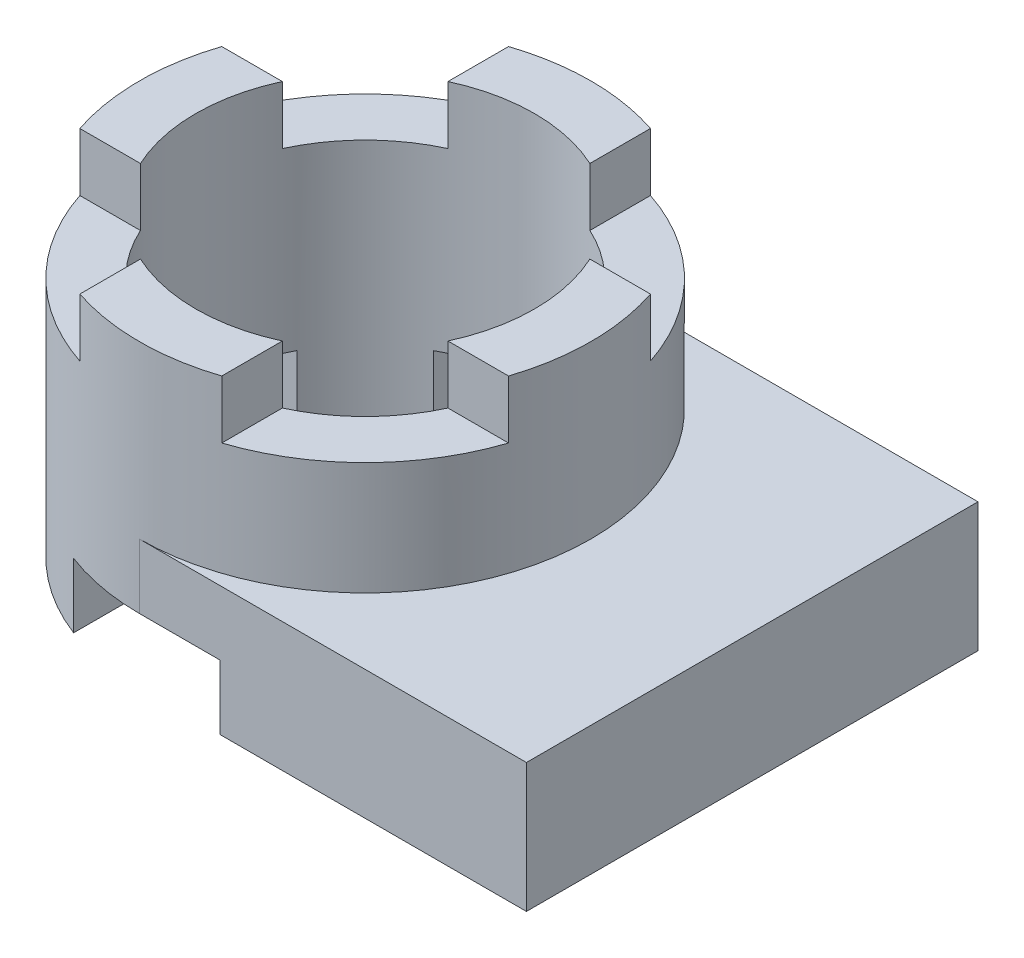
ISO-10303-21;
HEADER;
FILE_DESCRIPTION(('STEP AP214'),'2;1');
FILE_NAME('part.step','',(''),(''),'','','');
FILE_SCHEMA(('AUTOMOTIVE_DESIGN { 1 0 10303 214 1 1 1 1 }'));
ENDSEC;
DATA;
#1=APPLICATION_CONTEXT('core data for automotive mechanical design processes');
#2=APPLICATION_PROTOCOL_DEFINITION('international standard','automotive_design',2000,#1);
#3=PRODUCT_CONTEXT('',#1,'mechanical');
#4=PRODUCT('Part','Part','',(#3));
#5=PRODUCT_RELATED_PRODUCT_CATEGORY('part','',(#4));
#6=PRODUCT_DEFINITION_FORMATION('','',#4);
#7=PRODUCT_DEFINITION_CONTEXT('part definition',#1,'design');
#8=PRODUCT_DEFINITION('design','',#6,#7);
#9=PRODUCT_DEFINITION_SHAPE('','',#8);
#10=(LENGTH_UNIT() NAMED_UNIT(*) SI_UNIT(.MILLI.,.METRE.));
#11=(NAMED_UNIT(*) PLANE_ANGLE_UNIT() SI_UNIT($,.RADIAN.));
#12=(NAMED_UNIT(*) SI_UNIT($,.STERADIAN.) SOLID_ANGLE_UNIT());
#13=UNCERTAINTY_MEASURE_WITH_UNIT(LENGTH_MEASURE(1.E-05),#10,'distance_accuracy_value','');
#14=(GEOMETRIC_REPRESENTATION_CONTEXT(3) GLOBAL_UNCERTAINTY_ASSIGNED_CONTEXT((#13)) GLOBAL_UNIT_ASSIGNED_CONTEXT((#10,
#11,#12)) REPRESENTATION_CONTEXT('',''));
#15=CARTESIAN_POINT('',(0.,0.,0.));
#16=DIRECTION('',(0.,0.,1.));
#17=DIRECTION('',(1.,0.,0.));
#18=AXIS2_PLACEMENT_3D('',#15,#16,#17);
#19=CARTESIAN_POINT('',(0.,7.5,0.));
#20=DIRECTION('',(0.,1.,0.));
#21=DIRECTION('',(0.,0.,1.));
#22=AXIS2_PLACEMENT_3D('',#19,#20,#21);
#23=PLANE('',#22);
#24=CARTESIAN_POINT('',(0.,7.5,0.));
#25=DIRECTION('',(0.,1.,0.));
#26=DIRECTION('',(0.,0.,1.));
#27=AXIS2_PLACEMENT_3D('',#24,#25,#26);
#28=CIRCLE('',#27,7.);
#29=CARTESIAN_POINT('',(-2.2,7.5,-6.64529909033446));
#30=VERTEX_POINT('',#29);
#31=CARTESIAN_POINT('',(-6.64529909033446,7.5,-2.2));
#32=VERTEX_POINT('',#31);
#33=EDGE_CURVE('E699',#30,#32,#28,.T.);
#34=ORIENTED_EDGE('',*,*,#33,.T.);
#35=DIRECTION('',(1.,0.,0.));
#36=VECTOR('',#35,1.);
#37=CARTESIAN_POINT('',(0.,7.5,-2.2));
#38=LINE('',#37,#36);
#39=CARTESIAN_POINT('',(-4.76681235208604,7.5,-2.2));
#40=VERTEX_POINT('',#39);
#41=EDGE_CURVE('E298',#32,#40,#38,.T.);
#42=ORIENTED_EDGE('',*,*,#41,.T.);
#43=CARTESIAN_POINT('',(0.,7.5,0.));
#44=DIRECTION('',(0.,1.,0.));
#45=DIRECTION('',(0.,0.,1.));
#46=AXIS2_PLACEMENT_3D('',#43,#44,#45);
#47=CIRCLE('',#46,5.25);
#48=CARTESIAN_POINT('',(-2.2,7.5,-4.76681235208604));
#49=VERTEX_POINT('',#48);
#50=EDGE_CURVE('E692',#49,#40,#47,.T.);
#51=ORIENTED_EDGE('',*,*,#50,.F.);
#52=DIRECTION('',(0.,0.,-1.));
#53=VECTOR('',#52,1.);
#54=CARTESIAN_POINT('',(-2.2,7.5,0.));
#55=LINE('',#54,#53);
#56=EDGE_CURVE('E345',#49,#30,#55,.T.);
#57=ORIENTED_EDGE('',*,*,#56,.T.);
#58=EDGE_LOOP('',(#34,#42,#51,#57));
#59=FACE_BOUND('',#58,.T.);
#60=ADVANCED_FACE('F53',(#59),#23,.T.);
#61=CARTESIAN_POINT('',(-4.76681235208604,7.5,2.2));
#62=VERTEX_POINT('',#61);
#63=CARTESIAN_POINT('',(-2.2,7.5,4.76681235208604));
#64=VERTEX_POINT('',#63);
#65=EDGE_CURVE('E561',#62,#64,#47,.T.);
#66=ORIENTED_EDGE('',*,*,#65,.F.);
#67=DIRECTION('',(-1.,0.,0.));
#68=VECTOR('',#67,1.);
#69=CARTESIAN_POINT('',(0.,7.5,2.2));
#70=LINE('',#69,#68);
#71=CARTESIAN_POINT('',(-6.64529909033446,7.5,2.2));
#72=VERTEX_POINT('',#71);
#73=EDGE_CURVE('E320',#62,#72,#70,.T.);
#74=ORIENTED_EDGE('',*,*,#73,.T.);
#75=CARTESIAN_POINT('',(-2.2,7.5,6.64529909033446));
#76=VERTEX_POINT('',#75);
#77=EDGE_CURVE('E574',#72,#76,#28,.T.);
#78=ORIENTED_EDGE('',*,*,#77,.T.);
#79=DIRECTION('',(0.,0.,-1.));
#80=VECTOR('',#79,1.);
#81=CARTESIAN_POINT('',(-2.2,7.5,0.));
#82=LINE('',#81,#80);
#83=EDGE_CURVE('E421',#76,#64,#82,.T.);
#84=ORIENTED_EDGE('',*,*,#83,.T.);
#85=EDGE_LOOP('',(#66,#74,#78,#84));
#86=FACE_BOUND('',#85,.T.);
#87=ADVANCED_FACE('F737',(#86),#23,.T.);
#88=CARTESIAN_POINT('',(6.64529909033446,7.5,-2.2));
#89=VERTEX_POINT('',#88);
#90=CARTESIAN_POINT('',(2.2,7.5,-6.64529909033446));
#91=VERTEX_POINT('',#90);
#92=EDGE_CURVE('E573',#89,#91,#28,.T.);
#93=ORIENTED_EDGE('',*,*,#92,.T.);
#94=DIRECTION('',(0.,0.,1.));
#95=VECTOR('',#94,1.);
#96=CARTESIAN_POINT('',(2.2,7.5,0.));
#97=LINE('',#96,#95);
#98=CARTESIAN_POINT('',(2.2,7.5,-4.76681235208604));
#99=VERTEX_POINT('',#98);
#100=EDGE_CURVE('E355',#91,#99,#97,.T.);
#101=ORIENTED_EDGE('',*,*,#100,.T.);
#102=CARTESIAN_POINT('',(4.76681235208604,7.5,-2.2));
#103=VERTEX_POINT('',#102);
#104=EDGE_CURVE('E567',#103,#99,#47,.T.);
#105=ORIENTED_EDGE('',*,*,#104,.F.);
#106=DIRECTION('',(1.,0.,0.));
#107=VECTOR('',#106,1.);
#108=CARTESIAN_POINT('',(0.,7.5,-2.2));
#109=LINE('',#108,#107);
#110=EDGE_CURVE('E376',#103,#89,#109,.T.);
#111=ORIENTED_EDGE('',*,*,#110,.T.);
#112=EDGE_LOOP('',(#93,#101,#105,#111));
#113=FACE_BOUND('',#112,.T.);
#114=ADVANCED_FACE('F745',(#113),#23,.T.);
#115=CARTESIAN_POINT('',(2.2,7.5,6.64529909033446));
#116=VERTEX_POINT('',#115);
#117=CARTESIAN_POINT('',(6.64529909033446,7.5,2.2));
#118=VERTEX_POINT('',#117);
#119=EDGE_CURVE('E568',#116,#118,#28,.T.);
#120=ORIENTED_EDGE('',*,*,#119,.T.);
#121=DIRECTION('',(-1.,0.,0.));
#122=VECTOR('',#121,1.);
#123=CARTESIAN_POINT('',(0.,7.5,2.2));
#124=LINE('',#123,#122);
#125=CARTESIAN_POINT('',(4.76681235208604,7.5,2.2));
#126=VERTEX_POINT('',#125);
#127=EDGE_CURVE('E387',#118,#126,#124,.T.);
#128=ORIENTED_EDGE('',*,*,#127,.T.);
#129=CARTESIAN_POINT('',(2.2,7.5,4.76681235208604));
#130=VERTEX_POINT('',#129);
#131=EDGE_CURVE('E562',#130,#126,#47,.T.);
#132=ORIENTED_EDGE('',*,*,#131,.F.);
#133=DIRECTION('',(0.,0.,1.));
#134=VECTOR('',#133,1.);
#135=CARTESIAN_POINT('',(2.2,7.5,0.));
#136=LINE('',#135,#134);
#137=EDGE_CURVE('E410',#130,#116,#136,.T.);
#138=ORIENTED_EDGE('',*,*,#137,.T.);
#139=EDGE_LOOP('',(#120,#128,#132,#138));
#140=FACE_BOUND('',#139,.T.);
#141=ADVANCED_FACE('F740',(#140),#23,.T.);
#142=CARTESIAN_POINT('',(0.,4.,-7.));
#143=DIRECTION('',(0.,0.,-1.));
#144=DIRECTION('',(-1.,0.,0.));
#145=AXIS2_PLACEMENT_3D('',#142,#143,#144);
#146=PLANE('',#145);
#147=DIRECTION('',(1.,0.,0.));
#148=VECTOR('',#147,1.);
#149=CARTESIAN_POINT('',(0.,0.,-7.));
#150=LINE('',#149,#148);
#151=CARTESIAN_POINT('',(2.5,0.,-7.));
#152=VERTEX_POINT('',#151);
#153=CARTESIAN_POINT('',(12.,0.,-7.));
#154=VERTEX_POINT('',#153);
#155=EDGE_CURVE('E572',#152,#154,#150,.T.);
#156=ORIENTED_EDGE('',*,*,#155,.F.);
#157=DIRECTION('',(0.,1.,0.));
#158=VECTOR('',#157,1.);
#159=CARTESIAN_POINT('',(2.5,4.,-7.));
#160=LINE('',#159,#158);
#161=CARTESIAN_POINT('',(2.5,2.,-7.));
#162=VERTEX_POINT('',#161);
#163=EDGE_CURVE('E543',#152,#162,#160,.T.);
#164=ORIENTED_EDGE('',*,*,#163,.T.);
#165=DIRECTION('',(-1.,0.,0.));
#166=VECTOR('',#165,1.);
#167=CARTESIAN_POINT('',(0.,2.,-7.));
#168=LINE('',#167,#166);
#169=CARTESIAN_POINT('',(0.,2.,-7.));
#170=VERTEX_POINT('',#169);
#171=EDGE_CURVE('E557',#162,#170,#168,.T.);
#172=ORIENTED_EDGE('',*,*,#171,.T.);
#173=DIRECTION('',(0.,-1.,0.));
#174=VECTOR('',#173,1.);
#175=CARTESIAN_POINT('',(0.,4.,-7.));
#176=LINE('',#175,#174);
#177=CARTESIAN_POINT('',(0.,4.,-7.));
#178=VERTEX_POINT('',#177);
#179=EDGE_CURVE('E620',#178,#170,#176,.T.);
#180=ORIENTED_EDGE('',*,*,#179,.F.);
#181=DIRECTION('',(1.,0.,0.));
#182=VECTOR('',#181,1.);
#183=CARTESIAN_POINT('',(0.,4.,-7.));
#184=LINE('',#183,#182);
#185=CARTESIAN_POINT('',(12.,4.,-7.));
#186=VERTEX_POINT('',#185);
#187=EDGE_CURVE('E578',#178,#186,#184,.T.);
#188=ORIENTED_EDGE('',*,*,#187,.T.);
#189=DIRECTION('',(0.,-1.,0.));
#190=VECTOR('',#189,1.);
#191=CARTESIAN_POINT('',(12.,4.,-7.));
#192=LINE('',#191,#190);
#193=EDGE_CURVE('E590',#186,#154,#192,.T.);
#194=ORIENTED_EDGE('',*,*,#193,.T.);
#195=EDGE_LOOP('',(#156,#164,#172,#180,#188,#194));
#196=FACE_BOUND('',#195,.T.);
#197=ADVANCED_FACE('F55',(#196),#146,.T.);
#198=CARTESIAN_POINT('',(0.,4.,0.));
#199=DIRECTION('',(0.,-1.,0.));
#200=DIRECTION('',(0.,0.,-1.));
#201=AXIS2_PLACEMENT_3D('',#198,#199,#200);
#202=CYLINDRICAL_SURFACE('',#201,7.);
#203=ORIENTED_EDGE('',*,*,#119,.F.);
#204=DIRECTION('',(0.,-1.,0.));
#205=VECTOR('',#204,1.);
#206=CARTESIAN_POINT('',(2.2,9.3,6.64529909033446));
#207=LINE('',#206,#205);
#208=CARTESIAN_POINT('',(2.2,9.3,6.64529909033446));
#209=VERTEX_POINT('',#208);
#210=EDGE_CURVE('E433',#209,#116,#207,.T.);
#211=ORIENTED_EDGE('',*,*,#210,.F.);
#212=CARTESIAN_POINT('',(0.,9.3,0.));
#213=DIRECTION('',(0.,1.,0.));
#214=DIRECTION('',(0.,0.,1.));
#215=AXIS2_PLACEMENT_3D('',#212,#213,#214);
#216=CIRCLE('',#215,7.);
#217=CARTESIAN_POINT('',(-2.2,9.3,6.64529909033446));
#218=VERTEX_POINT('',#217);
#219=EDGE_CURVE('E409',#218,#209,#216,.T.);
#220=ORIENTED_EDGE('',*,*,#219,.F.);
#221=DIRECTION('',(0.,-1.,0.));
#222=VECTOR('',#221,1.);
#223=CARTESIAN_POINT('',(-2.2,9.3,6.64529909033446));
#224=LINE('',#223,#222);
#225=EDGE_CURVE('E391',#218,#76,#224,.T.);
#226=ORIENTED_EDGE('',*,*,#225,.T.);
#227=ORIENTED_EDGE('',*,*,#77,.F.);
#228=DIRECTION('',(0.,-1.,0.));
#229=VECTOR('',#228,1.);
#230=CARTESIAN_POINT('',(-6.64529909033446,9.3,2.2));
#231=LINE('',#230,#229);
#232=CARTESIAN_POINT('',(-6.64529909033446,9.3,2.2));
#233=VERTEX_POINT('',#232);
#234=EDGE_CURVE('E70',#233,#72,#231,.T.);
#235=ORIENTED_EDGE('',*,*,#234,.F.);
#236=CARTESIAN_POINT('',(0.,9.3,0.));
#237=DIRECTION('',(0.,1.,0.));
#238=DIRECTION('',(0.,0.,1.));
#239=AXIS2_PLACEMENT_3D('',#236,#237,#238);
#240=CIRCLE('',#239,7.);
#241=CARTESIAN_POINT('',(-6.64529909033446,9.3,-2.2));
#242=VERTEX_POINT('',#241);
#243=EDGE_CURVE('E305',#242,#233,#240,.T.);
#244=ORIENTED_EDGE('',*,*,#243,.F.);
#245=DIRECTION('',(0.,-1.,0.));
#246=VECTOR('',#245,1.);
#247=CARTESIAN_POINT('',(-6.64529909033446,9.3,-2.2));
#248=LINE('',#247,#246);
#249=EDGE_CURVE('E292',#242,#32,#248,.T.);
#250=ORIENTED_EDGE('',*,*,#249,.T.);
#251=ORIENTED_EDGE('',*,*,#33,.F.);
#252=DIRECTION('',(0.,-1.,0.));
#253=VECTOR('',#252,1.);
#254=CARTESIAN_POINT('',(-2.2,9.3,-6.64529909033446));
#255=LINE('',#254,#253);
#256=CARTESIAN_POINT('',(-2.2,9.3,-6.64529909033446));
#257=VERTEX_POINT('',#256);
#258=EDGE_CURVE('E78',#257,#30,#255,.T.);
#259=ORIENTED_EDGE('',*,*,#258,.F.);
#260=CARTESIAN_POINT('',(0.,9.3,0.));
#261=DIRECTION('',(0.,1.,0.));
#262=DIRECTION('',(0.,0.,1.));
#263=AXIS2_PLACEMENT_3D('',#260,#261,#262);
#264=CIRCLE('',#263,7.);
#265=CARTESIAN_POINT('',(2.2,9.3,-6.64529909033446));
#266=VERTEX_POINT('',#265);
#267=EDGE_CURVE('E344',#266,#257,#264,.T.);
#268=ORIENTED_EDGE('',*,*,#267,.F.);
#269=DIRECTION('',(0.,-1.,0.));
#270=VECTOR('',#269,1.);
#271=CARTESIAN_POINT('',(2.2,9.3,-6.64529909033446));
#272=LINE('',#271,#270);
#273=EDGE_CURVE('E331',#266,#91,#272,.T.);
#274=ORIENTED_EDGE('',*,*,#273,.T.);
#275=ORIENTED_EDGE('',*,*,#92,.F.);
#276=DIRECTION('',(0.,-1.,0.));
#277=VECTOR('',#276,1.);
#278=CARTESIAN_POINT('',(6.64529909033446,9.3,-2.2));
#279=LINE('',#278,#277);
#280=CARTESIAN_POINT('',(6.64529909033446,9.3,-2.2));
#281=VERTEX_POINT('',#280);
#282=EDGE_CURVE('E400',#281,#89,#279,.T.);
#283=ORIENTED_EDGE('',*,*,#282,.F.);
#284=CARTESIAN_POINT('',(0.,9.3,0.));
#285=DIRECTION('',(0.,1.,0.));
#286=DIRECTION('',(0.,0.,1.));
#287=AXIS2_PLACEMENT_3D('',#284,#285,#286);
#288=CIRCLE('',#287,7.);
#289=CARTESIAN_POINT('',(6.64529909033446,9.3,2.2));
#290=VERTEX_POINT('',#289);
#291=EDGE_CURVE('E375',#290,#281,#288,.T.);
#292=ORIENTED_EDGE('',*,*,#291,.F.);
#293=DIRECTION('',(0.,-1.,0.));
#294=VECTOR('',#293,1.);
#295=CARTESIAN_POINT('',(6.64529909033446,9.3,2.2));
#296=LINE('',#295,#294);
#297=EDGE_CURVE('E359',#290,#118,#296,.T.);
#298=ORIENTED_EDGE('',*,*,#297,.T.);
#299=EDGE_LOOP('',(#203,#211,#220,#226,#227,#235,#244,#250,#251,#259,#268,#274,#275,#283,#292,#298));
#300=FACE_BOUND('',#299,.T.);
#301=DIRECTION('',(0.,-1.,0.));
#302=VECTOR('',#301,1.);
#303=CARTESIAN_POINT('',(-2.5,4.,6.53834841531101));
#304=LINE('',#303,#302);
#305=CARTESIAN_POINT('',(-2.5,2.,6.53834841531101));
#306=VERTEX_POINT('',#305);
#307=CARTESIAN_POINT('',(-2.5,0.,6.53834841531101));
#308=VERTEX_POINT('',#307);
#309=EDGE_CURVE('E522',#306,#308,#304,.T.);
#310=ORIENTED_EDGE('',*,*,#309,.F.);
#311=CARTESIAN_POINT('',(0.,2.,0.));
#312=DIRECTION('',(0.,-1.,0.));
#313=DIRECTION('',(0.,0.,-1.));
#314=AXIS2_PLACEMENT_3D('',#311,#312,#313);
#315=CIRCLE('',#314,7.);
#316=CARTESIAN_POINT('',(0.,2.,7.));
#317=VERTEX_POINT('',#316);
#318=EDGE_CURVE('E553',#317,#306,#315,.T.);
#319=ORIENTED_EDGE('',*,*,#318,.F.);
#320=DIRECTION('',(0.,-1.,0.));
#321=VECTOR('',#320,1.);
#322=CARTESIAN_POINT('',(0.,4.,7.));
#323=LINE('',#322,#321);
#324=CARTESIAN_POINT('',(0.,4.,7.));
#325=VERTEX_POINT('',#324);
#326=EDGE_CURVE('E616',#325,#317,#323,.T.);
#327=ORIENTED_EDGE('',*,*,#326,.F.);
#328=CARTESIAN_POINT('',(0.,4.,0.));
#329=DIRECTION('',(0.,1.,0.));
#330=DIRECTION('',(0.,0.,1.));
#331=AXIS2_PLACEMENT_3D('',#328,#329,#330);
#332=CIRCLE('',#331,7.);
#333=EDGE_CURVE('E566',#325,#178,#332,.T.);
#334=ORIENTED_EDGE('',*,*,#333,.T.);
#335=ORIENTED_EDGE('',*,*,#179,.T.);
#336=CARTESIAN_POINT('',(-2.5,2.,-6.53834841531101));
#337=VERTEX_POINT('',#336);
#338=EDGE_CURVE('E556',#337,#170,#315,.T.);
#339=ORIENTED_EDGE('',*,*,#338,.F.);
#340=DIRECTION('',(0.,-1.,0.));
#341=VECTOR('',#340,1.);
#342=CARTESIAN_POINT('',(-2.5,4.,-6.53834841531101));
#343=LINE('',#342,#341);
#344=CARTESIAN_POINT('',(-2.5,0.,-6.53834841531101));
#345=VERTEX_POINT('',#344);
#346=EDGE_CURVE('E535',#337,#345,#343,.T.);
#347=ORIENTED_EDGE('',*,*,#346,.T.);
#348=CARTESIAN_POINT('',(0.,0.,0.));
#349=DIRECTION('',(0.,1.,0.));
#350=DIRECTION('',(0.,0.,1.));
#351=AXIS2_PLACEMENT_3D('',#348,#349,#350);
#352=CIRCLE('',#351,7.);
#353=EDGE_CURVE('E593',#345,#308,#352,.T.);
#354=ORIENTED_EDGE('',*,*,#353,.T.);
#355=EDGE_LOOP('',(#310,#319,#327,#334,#335,#339,#347,#354));
#356=FACE_BOUND('',#355,.T.);
#357=ADVANCED_FACE('F307',(#300,#356),#202,.T.);
#358=CARTESIAN_POINT('',(0.,4.,0.));
#359=DIRECTION('',(0.,-1.,0.));
#360=DIRECTION('',(0.,0.,-1.));
#361=AXIS2_PLACEMENT_3D('',#358,#359,#360);
#362=CYLINDRICAL_SURFACE('',#361,5.25);
#363=DIRECTION('',(0.,-1.,0.));
#364=VECTOR('',#363,1.);
#365=CARTESIAN_POINT('',(4.61654632815485,4.,-2.5));
#366=LINE('',#365,#364);
#367=CARTESIAN_POINT('',(4.61654632815485,2.,-2.5));
#368=VERTEX_POINT('',#367);
#369=CARTESIAN_POINT('',(4.61654632815485,0.,-2.5));
#370=VERTEX_POINT('',#369);
#371=EDGE_CURVE('E547',#368,#370,#366,.T.);
#372=ORIENTED_EDGE('',*,*,#371,.F.);
#373=CARTESIAN_POINT('',(0.,2.,0.));
#374=DIRECTION('',(0.,-1.,0.));
#375=DIRECTION('',(0.,0.,-1.));
#376=AXIS2_PLACEMENT_3D('',#373,#374,#375);
#377=CIRCLE('',#376,5.25);
#378=CARTESIAN_POINT('',(4.61654632815485,2.,2.5));
#379=VERTEX_POINT('',#378);
#380=EDGE_CURVE('E12',#368,#379,#377,.T.);
#381=ORIENTED_EDGE('',*,*,#380,.T.);
#382=DIRECTION('',(0.,-1.,0.));
#383=VECTOR('',#382,1.);
#384=CARTESIAN_POINT('',(4.61654632815485,4.,2.5));
#385=LINE('',#384,#383);
#386=CARTESIAN_POINT('',(4.61654632815485,0.,2.5));
#387=VERTEX_POINT('',#386);
#388=EDGE_CURVE('E508',#387,#379,#385,.F.);
#389=ORIENTED_EDGE('',*,*,#388,.F.);
#390=CARTESIAN_POINT('',(0.,0.,0.));
#391=DIRECTION('',(0.,1.,0.));
#392=DIRECTION('',(0.,0.,1.));
#393=AXIS2_PLACEMENT_3D('',#390,#391,#392);
#394=CIRCLE('',#393,5.25);
#395=CARTESIAN_POINT('',(2.5,0.,4.61654632815485));
#396=VERTEX_POINT('',#395);
#397=EDGE_CURVE('E583',#396,#387,#394,.T.);
#398=ORIENTED_EDGE('',*,*,#397,.F.);
#399=DIRECTION('',(0.,-1.,0.));
#400=VECTOR('',#399,1.);
#401=CARTESIAN_POINT('',(2.5,4.,4.61654632815485));
#402=LINE('',#401,#400);
#403=CARTESIAN_POINT('',(2.5,2.,4.61654632815485));
#404=VERTEX_POINT('',#403);
#405=EDGE_CURVE('E511',#404,#396,#402,.T.);
#406=ORIENTED_EDGE('',*,*,#405,.F.);
#407=CARTESIAN_POINT('',(-2.5,2.,4.61654632815485));
#408=VERTEX_POINT('',#407);
#409=EDGE_CURVE('E63',#404,#408,#377,.T.);
#410=ORIENTED_EDGE('',*,*,#409,.T.);
#411=DIRECTION('',(0.,-1.,0.));
#412=VECTOR('',#411,1.);
#413=CARTESIAN_POINT('',(-2.5,4.,4.61654632815485));
#414=LINE('',#413,#412);
#415=CARTESIAN_POINT('',(-2.5,0.,4.61654632815485));
#416=VERTEX_POINT('',#415);
#417=EDGE_CURVE('E518',#408,#416,#414,.T.);
#418=ORIENTED_EDGE('',*,*,#417,.T.);
#419=CARTESIAN_POINT('',(-4.61654632815485,0.,2.5));
#420=VERTEX_POINT('',#419);
#421=EDGE_CURVE('E604',#420,#416,#394,.T.);
#422=ORIENTED_EDGE('',*,*,#421,.F.);
#423=DIRECTION('',(0.,-1.,0.));
#424=VECTOR('',#423,1.);
#425=CARTESIAN_POINT('',(-4.61654632815485,4.,2.5));
#426=LINE('',#425,#424);
#427=CARTESIAN_POINT('',(-4.61654632815485,2.,2.5));
#428=VERTEX_POINT('',#427);
#429=EDGE_CURVE('E525',#420,#428,#426,.F.);
#430=ORIENTED_EDGE('',*,*,#429,.T.);
#431=CARTESIAN_POINT('',(-4.61654632815485,2.,-2.5));
#432=VERTEX_POINT('',#431);
#433=EDGE_CURVE('E644',#428,#432,#377,.T.);
#434=ORIENTED_EDGE('',*,*,#433,.T.);
#435=DIRECTION('',(0.,-1.,0.));
#436=VECTOR('',#435,1.);
#437=CARTESIAN_POINT('',(-4.61654632815485,4.,-2.5));
#438=LINE('',#437,#436);
#439=CARTESIAN_POINT('',(-4.61654632815485,0.,-2.5));
#440=VERTEX_POINT('',#439);
#441=EDGE_CURVE('E529',#440,#432,#438,.F.);
#442=ORIENTED_EDGE('',*,*,#441,.F.);
#443=CARTESIAN_POINT('',(-2.5,0.,-4.61654632815485));
#444=VERTEX_POINT('',#443);
#445=EDGE_CURVE('E704',#444,#440,#394,.T.);
#446=ORIENTED_EDGE('',*,*,#445,.F.);
#447=DIRECTION('',(0.,-1.,0.));
#448=VECTOR('',#447,1.);
#449=CARTESIAN_POINT('',(-2.5,4.,-4.61654632815485));
#450=LINE('',#449,#448);
#451=CARTESIAN_POINT('',(-2.5,2.,-4.61654632815485));
#452=VERTEX_POINT('',#451);
#453=EDGE_CURVE('E532',#452,#444,#450,.T.);
#454=ORIENTED_EDGE('',*,*,#453,.F.);
#455=CARTESIAN_POINT('',(2.5,2.,-4.61654632815485));
#456=VERTEX_POINT('',#455);
#457=EDGE_CURVE('E57',#452,#456,#377,.T.);
#458=ORIENTED_EDGE('',*,*,#457,.T.);
#459=DIRECTION('',(0.,-1.,0.));
#460=VECTOR('',#459,1.);
#461=CARTESIAN_POINT('',(2.5,4.,-4.61654632815485));
#462=LINE('',#461,#460);
#463=CARTESIAN_POINT('',(2.5,0.,-4.61654632815485));
#464=VERTEX_POINT('',#463);
#465=EDGE_CURVE('E539',#456,#464,#462,.T.);
#466=ORIENTED_EDGE('',*,*,#465,.T.);
#467=EDGE_CURVE('E608',#370,#464,#394,.T.);
#468=ORIENTED_EDGE('',*,*,#467,.F.);
#469=EDGE_LOOP('',(#372,#381,#389,#398,#406,#410,#418,#422,#430,#434,#442,#446,#454,#458,#466,#468));
#470=FACE_BOUND('',#469,.T.);
#471=ORIENTED_EDGE('',*,*,#131,.T.);
#472=DIRECTION('',(0.,-1.,0.));
#473=VECTOR('',#472,1.);
#474=CARTESIAN_POINT('',(4.76681235208604,9.3,2.2));
#475=LINE('',#474,#473);
#476=CARTESIAN_POINT('',(4.76681235208604,9.3,2.2));
#477=VERTEX_POINT('',#476);
#478=EDGE_CURVE('E386',#477,#126,#475,.T.);
#479=ORIENTED_EDGE('',*,*,#478,.F.);
#480=CARTESIAN_POINT('',(0.,9.3,0.));
#481=DIRECTION('',(0.,1.,0.));
#482=DIRECTION('',(0.,0.,1.));
#483=AXIS2_PLACEMENT_3D('',#480,#481,#482);
#484=CIRCLE('',#483,5.25);
#485=CARTESIAN_POINT('',(4.76681235208604,9.3,-2.2));
#486=VERTEX_POINT('',#485);
#487=EDGE_CURVE('E383',#486,#477,#484,.F.);
#488=ORIENTED_EDGE('',*,*,#487,.F.);
#489=DIRECTION('',(0.,-1.,0.));
#490=VECTOR('',#489,1.);
#491=CARTESIAN_POINT('',(4.76681235208604,9.3,-2.2));
#492=LINE('',#491,#490);
#493=EDGE_CURVE('E397',#486,#103,#492,.T.);
#494=ORIENTED_EDGE('',*,*,#493,.T.);
#495=ORIENTED_EDGE('',*,*,#104,.T.);
#496=DIRECTION('',(0.,-1.,0.));
#497=VECTOR('',#496,1.);
#498=CARTESIAN_POINT('',(2.2,9.3,-4.76681235208604));
#499=LINE('',#498,#497);
#500=CARTESIAN_POINT('',(2.2,9.3,-4.76681235208604));
#501=VERTEX_POINT('',#500);
#502=EDGE_CURVE('E354',#501,#99,#499,.T.);
#503=ORIENTED_EDGE('',*,*,#502,.F.);
#504=CARTESIAN_POINT('',(0.,9.3,0.));
#505=DIRECTION('',(0.,1.,0.));
#506=DIRECTION('',(0.,0.,1.));
#507=AXIS2_PLACEMENT_3D('',#504,#505,#506);
#508=CIRCLE('',#507,5.25);
#509=CARTESIAN_POINT('',(-2.2,9.3,-4.76681235208604));
#510=VERTEX_POINT('',#509);
#511=EDGE_CURVE('E351',#510,#501,#508,.F.);
#512=ORIENTED_EDGE('',*,*,#511,.F.);
#513=DIRECTION('',(0.,-1.,0.));
#514=VECTOR('',#513,1.);
#515=CARTESIAN_POINT('',(-2.2,9.3,-4.76681235208604));
#516=LINE('',#515,#514);
#517=EDGE_CURVE('E364',#510,#49,#516,.T.);
#518=ORIENTED_EDGE('',*,*,#517,.T.);
#519=ORIENTED_EDGE('',*,*,#50,.T.);
#520=DIRECTION('',(0.,-1.,0.));
#521=VECTOR('',#520,1.);
#522=CARTESIAN_POINT('',(-4.76681235208604,9.3,-2.2));
#523=LINE('',#522,#521);
#524=CARTESIAN_POINT('',(-4.76681235208604,9.3,-2.2));
#525=VERTEX_POINT('',#524);
#526=EDGE_CURVE('E329',#525,#40,#523,.T.);
#527=ORIENTED_EDGE('',*,*,#526,.F.);
#528=CARTESIAN_POINT('',(0.,9.3,0.));
#529=DIRECTION('',(0.,1.,0.));
#530=DIRECTION('',(0.,0.,1.));
#531=AXIS2_PLACEMENT_3D('',#528,#529,#530);
#532=CIRCLE('',#531,5.25);
#533=CARTESIAN_POINT('',(-4.76681235208604,9.3,2.2));
#534=VERTEX_POINT('',#533);
#535=EDGE_CURVE('E317',#534,#525,#532,.F.);
#536=ORIENTED_EDGE('',*,*,#535,.F.);
#537=DIRECTION('',(0.,-1.,0.));
#538=VECTOR('',#537,1.);
#539=CARTESIAN_POINT('',(-4.76681235208604,9.3,2.2));
#540=LINE('',#539,#538);
#541=EDGE_CURVE('E335',#534,#62,#540,.T.);
#542=ORIENTED_EDGE('',*,*,#541,.T.);
#543=ORIENTED_EDGE('',*,*,#65,.T.);
#544=DIRECTION('',(0.,-1.,0.));
#545=VECTOR('',#544,1.);
#546=CARTESIAN_POINT('',(-2.2,9.3,4.76681235208604));
#547=LINE('',#546,#545);
#548=CARTESIAN_POINT('',(-2.2,9.3,4.76681235208604));
#549=VERTEX_POINT('',#548);
#550=EDGE_CURVE('E420',#549,#64,#547,.T.);
#551=ORIENTED_EDGE('',*,*,#550,.F.);
#552=CARTESIAN_POINT('',(0.,9.3,0.));
#553=DIRECTION('',(0.,1.,0.));
#554=DIRECTION('',(0.,0.,1.));
#555=AXIS2_PLACEMENT_3D('',#552,#553,#554);
#556=CIRCLE('',#555,5.25);
#557=CARTESIAN_POINT('',(2.2,9.3,4.76681235208604));
#558=VERTEX_POINT('',#557);
#559=EDGE_CURVE('E417',#558,#549,#556,.F.);
#560=ORIENTED_EDGE('',*,*,#559,.F.);
#561=DIRECTION('',(0.,-1.,0.));
#562=VECTOR('',#561,1.);
#563=CARTESIAN_POINT('',(2.2,9.3,4.76681235208604));
#564=LINE('',#563,#562);
#565=EDGE_CURVE('E430',#558,#130,#564,.T.);
#566=ORIENTED_EDGE('',*,*,#565,.T.);
#567=EDGE_LOOP('',(#471,#479,#488,#494,#495,#503,#512,#518,#519,#527,#536,#542,#543,#551,#560,#566));
#568=FACE_BOUND('',#567,.T.);
#569=ADVANCED_FACE('F654',(#470,#568),#362,.F.);
#570=CARTESIAN_POINT('',(0.,0.,0.));
#571=DIRECTION('',(0.,1.,0.));
#572=DIRECTION('',(0.,0.,1.));
#573=AXIS2_PLACEMENT_3D('',#570,#571,#572);
#574=PLANE('',#573);
#575=DIRECTION('',(0.,0.,1.));
#576=VECTOR('',#575,1.);
#577=CARTESIAN_POINT('',(2.5,0.,0.));
#578=LINE('',#577,#576);
#579=EDGE_CURVE('E638',#152,#464,#578,.T.);
#580=ORIENTED_EDGE('',*,*,#579,.F.);
#581=ORIENTED_EDGE('',*,*,#155,.T.);
#582=DIRECTION('',(0.,0.,1.));
#583=VECTOR('',#582,1.);
#584=CARTESIAN_POINT('',(12.,0.,0.));
#585=LINE('',#584,#583);
#586=CARTESIAN_POINT('',(12.,0.,7.));
#587=VERTEX_POINT('',#586);
#588=EDGE_CURVE('E600',#154,#587,#585,.T.);
#589=ORIENTED_EDGE('',*,*,#588,.T.);
#590=DIRECTION('',(1.,0.,0.));
#591=VECTOR('',#590,1.);
#592=CARTESIAN_POINT('',(0.,0.,7.));
#593=LINE('',#592,#591);
#594=CARTESIAN_POINT('',(2.5,0.,7.));
#595=VERTEX_POINT('',#594);
#596=EDGE_CURVE('E597',#595,#587,#593,.T.);
#597=ORIENTED_EDGE('',*,*,#596,.F.);
#598=DIRECTION('',(0.,0.,-1.));
#599=VECTOR('',#598,1.);
#600=CARTESIAN_POINT('',(2.5,0.,0.));
#601=LINE('',#600,#599);
#602=EDGE_CURVE('E628',#595,#396,#601,.T.);
#603=ORIENTED_EDGE('',*,*,#602,.T.);
#604=ORIENTED_EDGE('',*,*,#397,.T.);
#605=DIRECTION('',(-1.,0.,0.));
#606=VECTOR('',#605,1.);
#607=CARTESIAN_POINT('',(6.,0.,2.5));
#608=LINE('',#607,#606);
#609=CARTESIAN_POINT('',(6.,0.,2.5));
#610=VERTEX_POINT('',#609);
#611=EDGE_CURVE('E443',#610,#387,#608,.T.);
#612=ORIENTED_EDGE('',*,*,#611,.F.);
#613=DIRECTION('',(0.,0.,-1.));
#614=VECTOR('',#613,1.);
#615=CARTESIAN_POINT('',(6.,0.,2.5));
#616=LINE('',#615,#614);
#617=CARTESIAN_POINT('',(6.,0.,-2.5));
#618=VERTEX_POINT('',#617);
#619=EDGE_CURVE('E303',#610,#618,#616,.T.);
#620=ORIENTED_EDGE('',*,*,#619,.T.);
#621=DIRECTION('',(-1.,0.,0.));
#622=VECTOR('',#621,1.);
#623=CARTESIAN_POINT('',(0.,0.,-2.5));
#624=LINE('',#623,#622);
#625=EDGE_CURVE('E624',#618,#370,#624,.T.);
#626=ORIENTED_EDGE('',*,*,#625,.T.);
#627=ORIENTED_EDGE('',*,*,#467,.T.);
#628=EDGE_LOOP('',(#580,#581,#589,#597,#603,#604,#612,#620,#626,#627));
#629=FACE_BOUND('',#628,.T.);
#630=ADVANCED_FACE('F671',(#629),#574,.F.);
#631=ORIENTED_EDGE('',*,*,#353,.F.);
#632=DIRECTION('',(0.,0.,1.));
#633=VECTOR('',#632,1.);
#634=CARTESIAN_POINT('',(-2.5,0.,0.));
#635=LINE('',#634,#633);
#636=EDGE_CURVE('E635',#345,#444,#635,.T.);
#637=ORIENTED_EDGE('',*,*,#636,.T.);
#638=ORIENTED_EDGE('',*,*,#445,.T.);
#639=DIRECTION('',(1.,0.,0.));
#640=VECTOR('',#639,1.);
#641=CARTESIAN_POINT('',(-6.,0.,-2.5));
#642=LINE('',#641,#640);
#643=CARTESIAN_POINT('',(-6.,0.,-2.5));
#644=VERTEX_POINT('',#643);
#645=EDGE_CURVE('E482',#644,#440,#642,.T.);
#646=ORIENTED_EDGE('',*,*,#645,.F.);
#647=DIRECTION('',(0.,0.,-1.));
#648=VECTOR('',#647,1.);
#649=CARTESIAN_POINT('',(-6.,0.,2.5));
#650=LINE('',#649,#648);
#651=CARTESIAN_POINT('',(-6.,0.,2.5));
#652=VERTEX_POINT('',#651);
#653=EDGE_CURVE('E485',#652,#644,#650,.T.);
#654=ORIENTED_EDGE('',*,*,#653,.F.);
#655=DIRECTION('',(1.,0.,0.));
#656=VECTOR('',#655,1.);
#657=CARTESIAN_POINT('',(-6.,0.,2.5));
#658=LINE('',#657,#656);
#659=EDGE_CURVE('E489',#652,#420,#658,.T.);
#660=ORIENTED_EDGE('',*,*,#659,.T.);
#661=ORIENTED_EDGE('',*,*,#421,.T.);
#662=DIRECTION('',(0.,0.,-1.));
#663=VECTOR('',#662,1.);
#664=CARTESIAN_POINT('',(-2.5,0.,0.));
#665=LINE('',#664,#663);
#666=EDGE_CURVE('E632',#308,#416,#665,.T.);
#667=ORIENTED_EDGE('',*,*,#666,.F.);
#668=EDGE_LOOP('',(#631,#637,#638,#646,#654,#660,#661,#667));
#669=FACE_BOUND('',#668,.T.);
#670=ADVANCED_FACE('F718',(#669),#574,.F.);
#671=CARTESIAN_POINT('',(0.,4.,7.));
#672=DIRECTION('',(0.,0.,-1.));
#673=DIRECTION('',(-1.,0.,0.));
#674=AXIS2_PLACEMENT_3D('',#671,#672,#673);
#675=PLANE('',#674);
#676=DIRECTION('',(-1.,0.,0.));
#677=VECTOR('',#676,1.);
#678=CARTESIAN_POINT('',(0.,2.,7.));
#679=LINE('',#678,#677);
#680=CARTESIAN_POINT('',(2.5,2.,7.));
#681=VERTEX_POINT('',#680);
#682=EDGE_CURVE('E550',#681,#317,#679,.T.);
#683=ORIENTED_EDGE('',*,*,#682,.F.);
#684=DIRECTION('',(0.,-1.,0.));
#685=VECTOR('',#684,1.);
#686=CARTESIAN_POINT('',(2.5,4.,7.));
#687=LINE('',#686,#685);
#688=EDGE_CURVE('E514',#681,#595,#687,.T.);
#689=ORIENTED_EDGE('',*,*,#688,.T.);
#690=ORIENTED_EDGE('',*,*,#596,.T.);
#691=DIRECTION('',(0.,-1.,0.));
#692=VECTOR('',#691,1.);
#693=CARTESIAN_POINT('',(12.,4.,7.));
#694=LINE('',#693,#692);
#695=CARTESIAN_POINT('',(12.,4.,7.));
#696=VERTEX_POINT('',#695);
#697=EDGE_CURVE('E612',#696,#587,#694,.T.);
#698=ORIENTED_EDGE('',*,*,#697,.F.);
#699=DIRECTION('',(1.,0.,0.));
#700=VECTOR('',#699,1.);
#701=CARTESIAN_POINT('',(0.,4.,7.));
#702=LINE('',#701,#700);
#703=EDGE_CURVE('E582',#325,#696,#702,.T.);
#704=ORIENTED_EDGE('',*,*,#703,.F.);
#705=ORIENTED_EDGE('',*,*,#326,.T.);
#706=EDGE_LOOP('',(#683,#689,#690,#698,#704,#705));
#707=FACE_BOUND('',#706,.T.);
#708=ADVANCED_FACE('F668',(#707),#675,.F.);
#709=CARTESIAN_POINT('',(12.,4.,0.));
#710=DIRECTION('',(1.,0.,0.));
#711=DIRECTION('',(0.,0.,-1.));
#712=AXIS2_PLACEMENT_3D('',#709,#710,#711);
#713=PLANE('',#712);
#714=ORIENTED_EDGE('',*,*,#588,.F.);
#715=ORIENTED_EDGE('',*,*,#193,.F.);
#716=DIRECTION('',(0.,0.,1.));
#717=VECTOR('',#716,1.);
#718=CARTESIAN_POINT('',(12.,4.,0.));
#719=LINE('',#718,#717);
#720=EDGE_CURVE('E586',#186,#696,#719,.T.);
#721=ORIENTED_EDGE('',*,*,#720,.T.);
#722=ORIENTED_EDGE('',*,*,#697,.T.);
#723=EDGE_LOOP('',(#714,#715,#721,#722));
#724=FACE_BOUND('',#723,.T.);
#725=ADVANCED_FACE('F675',(#724),#713,.T.);
#726=CARTESIAN_POINT('',(0.,4.,0.));
#727=DIRECTION('',(0.,1.,0.));
#728=DIRECTION('',(0.,0.,1.));
#729=AXIS2_PLACEMENT_3D('',#726,#727,#728);
#730=PLANE('',#729);
#731=ORIENTED_EDGE('',*,*,#333,.F.);
#732=ORIENTED_EDGE('',*,*,#703,.T.);
#733=ORIENTED_EDGE('',*,*,#720,.F.);
#734=ORIENTED_EDGE('',*,*,#187,.F.);
#735=EDGE_LOOP('',(#731,#732,#733,#734));
#736=FACE_BOUND('',#735,.T.);
#737=ADVANCED_FACE('F683',(#736),#730,.T.);
#738=CARTESIAN_POINT('',(6.,2.,2.5));
#739=DIRECTION('',(0.,0.,1.));
#740=DIRECTION('',(1.,0.,0.));
#741=AXIS2_PLACEMENT_3D('',#738,#739,#740);
#742=PLANE('',#741);
#743=ORIENTED_EDGE('',*,*,#388,.T.);
#744=DIRECTION('',(-1.,0.,0.));
#745=VECTOR('',#744,1.);
#746=CARTESIAN_POINT('',(6.,2.,2.5));
#747=LINE('',#746,#745);
#748=CARTESIAN_POINT('',(6.,2.,2.5));
#749=VERTEX_POINT('',#748);
#750=EDGE_CURVE('E474',#749,#379,#747,.T.);
#751=ORIENTED_EDGE('',*,*,#750,.F.);
#752=DIRECTION('',(0.,-1.,0.));
#753=VECTOR('',#752,1.);
#754=CARTESIAN_POINT('',(6.,2.,2.5));
#755=LINE('',#754,#753);
#756=EDGE_CURVE('E478',#749,#610,#755,.T.);
#757=ORIENTED_EDGE('',*,*,#756,.T.);
#758=ORIENTED_EDGE('',*,*,#611,.T.);
#759=EDGE_LOOP('',(#743,#751,#757,#758));
#760=FACE_BOUND('',#759,.T.);
#761=ADVANCED_FACE('F820',(#760),#742,.F.);
#762=CARTESIAN_POINT('',(2.5,2.,-2.5));
#763=DIRECTION('',(0.,0.,-1.));
#764=DIRECTION('',(-1.,0.,0.));
#765=AXIS2_PLACEMENT_3D('',#762,#763,#764);
#766=PLANE('',#765);
#767=ORIENTED_EDGE('',*,*,#371,.T.);
#768=ORIENTED_EDGE('',*,*,#625,.F.);
#769=DIRECTION('',(0.,-1.,0.));
#770=VECTOR('',#769,1.);
#771=CARTESIAN_POINT('',(6.,2.,-2.5));
#772=LINE('',#771,#770);
#773=CARTESIAN_POINT('',(6.,2.,-2.5));
#774=VERTEX_POINT('',#773);
#775=EDGE_CURVE('E504',#774,#618,#772,.T.);
#776=ORIENTED_EDGE('',*,*,#775,.F.);
#777=DIRECTION('',(1.,0.,0.));
#778=VECTOR('',#777,1.);
#779=CARTESIAN_POINT('',(2.5,2.,-2.5));
#780=LINE('',#779,#778);
#781=EDGE_CURVE('E442',#368,#774,#780,.T.);
#782=ORIENTED_EDGE('',*,*,#781,.F.);
#783=EDGE_LOOP('',(#767,#768,#776,#782));
#784=FACE_BOUND('',#783,.T.);
#785=ADVANCED_FACE('F822',(#784),#766,.F.);
#786=CARTESIAN_POINT('',(6.,2.,2.5));
#787=DIRECTION('',(-1.,0.,0.));
#788=DIRECTION('',(0.,0.,1.));
#789=AXIS2_PLACEMENT_3D('',#786,#787,#788);
#790=PLANE('',#789);
#791=ORIENTED_EDGE('',*,*,#619,.F.);
#792=ORIENTED_EDGE('',*,*,#756,.F.);
#793=DIRECTION('',(0.,0.,-1.));
#794=VECTOR('',#793,1.);
#795=CARTESIAN_POINT('',(6.,2.,2.5));
#796=LINE('',#795,#794);
#797=EDGE_CURVE('E438',#749,#774,#796,.T.);
#798=ORIENTED_EDGE('',*,*,#797,.T.);
#799=ORIENTED_EDGE('',*,*,#775,.T.);
#800=EDGE_LOOP('',(#791,#792,#798,#799));
#801=FACE_BOUND('',#800,.T.);
#802=ADVANCED_FACE('F731',(#801),#790,.T.);
#803=CARTESIAN_POINT('',(0.,2.,0.));
#804=DIRECTION('',(0.,-1.,0.));
#805=DIRECTION('',(0.,0.,-1.));
#806=AXIS2_PLACEMENT_3D('',#803,#804,#805);
#807=PLANE('',#806);
#808=ORIENTED_EDGE('',*,*,#781,.T.);
#809=ORIENTED_EDGE('',*,*,#797,.F.);
#810=ORIENTED_EDGE('',*,*,#750,.T.);
#811=ORIENTED_EDGE('',*,*,#380,.F.);
#812=EDGE_LOOP('',(#808,#809,#810,#811));
#813=FACE_BOUND('',#812,.T.);
#814=ADVANCED_FACE('F724',(#813),#807,.T.);
#815=CARTESIAN_POINT('',(-2.5,2.,2.5));
#816=DIRECTION('',(1.,0.,0.));
#817=DIRECTION('',(0.,0.,-1.));
#818=AXIS2_PLACEMENT_3D('',#815,#816,#817);
#819=PLANE('',#818);
#820=ORIENTED_EDGE('',*,*,#309,.T.);
#821=ORIENTED_EDGE('',*,*,#666,.T.);
#822=ORIENTED_EDGE('',*,*,#417,.F.);
#823=DIRECTION('',(0.,0.,1.));
#824=VECTOR('',#823,1.);
#825=CARTESIAN_POINT('',(-2.5,2.,2.5));
#826=LINE('',#825,#824);
#827=EDGE_CURVE('E466',#408,#306,#826,.T.);
#828=ORIENTED_EDGE('',*,*,#827,.T.);
#829=EDGE_LOOP('',(#820,#821,#822,#828));
#830=FACE_BOUND('',#829,.T.);
#831=ADVANCED_FACE('F722',(#830),#819,.T.);
#832=CARTESIAN_POINT('',(2.5,2.,2.5));
#833=DIRECTION('',(1.,0.,0.));
#834=DIRECTION('',(0.,0.,-1.));
#835=AXIS2_PLACEMENT_3D('',#832,#833,#834);
#836=PLANE('',#835);
#837=DIRECTION('',(0.,0.,1.));
#838=VECTOR('',#837,1.);
#839=CARTESIAN_POINT('',(2.5,2.,2.5));
#840=LINE('',#839,#838);
#841=EDGE_CURVE('E470',#404,#681,#840,.T.);
#842=ORIENTED_EDGE('',*,*,#841,.F.);
#843=ORIENTED_EDGE('',*,*,#405,.T.);
#844=ORIENTED_EDGE('',*,*,#602,.F.);
#845=ORIENTED_EDGE('',*,*,#688,.F.);
#846=EDGE_LOOP('',(#842,#843,#844,#845));
#847=FACE_BOUND('',#846,.T.);
#848=ADVANCED_FACE('F665',(#847),#836,.F.);
#849=ORIENTED_EDGE('',*,*,#318,.T.);
#850=ORIENTED_EDGE('',*,*,#827,.F.);
#851=ORIENTED_EDGE('',*,*,#409,.F.);
#852=ORIENTED_EDGE('',*,*,#841,.T.);
#853=ORIENTED_EDGE('',*,*,#682,.T.);
#854=EDGE_LOOP('',(#849,#850,#851,#852,#853));
#855=FACE_BOUND('',#854,.T.);
#856=ADVANCED_FACE('F662',(#855),#807,.T.);
#857=CARTESIAN_POINT('',(-6.,2.,2.5));
#858=DIRECTION('',(0.,0.,-1.));
#859=DIRECTION('',(-1.,0.,0.));
#860=AXIS2_PLACEMENT_3D('',#857,#858,#859);
#861=PLANE('',#860);
#862=ORIENTED_EDGE('',*,*,#659,.F.);
#863=DIRECTION('',(0.,-1.,0.));
#864=VECTOR('',#863,1.);
#865=CARTESIAN_POINT('',(-6.,2.,2.5));
#866=LINE('',#865,#864);
#867=CARTESIAN_POINT('',(-6.,2.,2.5));
#868=VERTEX_POINT('',#867);
#869=EDGE_CURVE('E498',#868,#652,#866,.T.);
#870=ORIENTED_EDGE('',*,*,#869,.F.);
#871=DIRECTION('',(1.,0.,0.));
#872=VECTOR('',#871,1.);
#873=CARTESIAN_POINT('',(-6.,2.,2.5));
#874=LINE('',#873,#872);
#875=EDGE_CURVE('E462',#868,#428,#874,.T.);
#876=ORIENTED_EDGE('',*,*,#875,.T.);
#877=ORIENTED_EDGE('',*,*,#429,.F.);
#878=EDGE_LOOP('',(#862,#870,#876,#877));
#879=FACE_BOUND('',#878,.T.);
#880=ADVANCED_FACE('F852',(#879),#861,.T.);
#881=CARTESIAN_POINT('',(-6.,2.,2.5));
#882=DIRECTION('',(-1.,0.,0.));
#883=DIRECTION('',(0.,0.,1.));
#884=AXIS2_PLACEMENT_3D('',#881,#882,#883);
#885=PLANE('',#884);
#886=ORIENTED_EDGE('',*,*,#653,.T.);
#887=DIRECTION('',(0.,-1.,0.));
#888=VECTOR('',#887,1.);
#889=CARTESIAN_POINT('',(-6.,2.,-2.5));
#890=LINE('',#889,#888);
#891=CARTESIAN_POINT('',(-6.,2.,-2.5));
#892=VERTEX_POINT('',#891);
#893=EDGE_CURVE('E501',#892,#644,#890,.T.);
#894=ORIENTED_EDGE('',*,*,#893,.F.);
#895=DIRECTION('',(0.,0.,-1.));
#896=VECTOR('',#895,1.);
#897=CARTESIAN_POINT('',(-6.,2.,2.5));
#898=LINE('',#897,#896);
#899=EDGE_CURVE('E458',#868,#892,#898,.T.);
#900=ORIENTED_EDGE('',*,*,#899,.F.);
#901=ORIENTED_EDGE('',*,*,#869,.T.);
#902=EDGE_LOOP('',(#886,#894,#900,#901));
#903=FACE_BOUND('',#902,.T.);
#904=ADVANCED_FACE('F849',(#903),#885,.F.);
#905=CARTESIAN_POINT('',(-6.,2.,-2.5));
#906=DIRECTION('',(0.,0.,-1.));
#907=DIRECTION('',(-1.,0.,0.));
#908=AXIS2_PLACEMENT_3D('',#905,#906,#907);
#909=PLANE('',#908);
#910=ORIENTED_EDGE('',*,*,#441,.T.);
#911=DIRECTION('',(1.,0.,0.));
#912=VECTOR('',#911,1.);
#913=CARTESIAN_POINT('',(-6.,2.,-2.5));
#914=LINE('',#913,#912);
#915=EDGE_CURVE('E454',#892,#432,#914,.T.);
#916=ORIENTED_EDGE('',*,*,#915,.F.);
#917=ORIENTED_EDGE('',*,*,#893,.T.);
#918=ORIENTED_EDGE('',*,*,#645,.T.);
#919=EDGE_LOOP('',(#910,#916,#917,#918));
#920=FACE_BOUND('',#919,.T.);
#921=ADVANCED_FACE('F846',(#920),#909,.F.);
#922=ORIENTED_EDGE('',*,*,#875,.F.);
#923=ORIENTED_EDGE('',*,*,#899,.T.);
#924=ORIENTED_EDGE('',*,*,#915,.T.);
#925=ORIENTED_EDGE('',*,*,#433,.F.);
#926=EDGE_LOOP('',(#922,#923,#924,#925));
#927=FACE_BOUND('',#926,.T.);
#928=ADVANCED_FACE('F734',(#927),#807,.T.);
#929=CARTESIAN_POINT('',(-2.5,2.,-2.5));
#930=DIRECTION('',(-1.,0.,0.));
#931=DIRECTION('',(0.,0.,1.));
#932=AXIS2_PLACEMENT_3D('',#929,#930,#931);
#933=PLANE('',#932);
#934=DIRECTION('',(0.,0.,-1.));
#935=VECTOR('',#934,1.);
#936=CARTESIAN_POINT('',(-2.5,2.,-2.5));
#937=LINE('',#936,#935);
#938=EDGE_CURVE('E450',#452,#337,#937,.T.);
#939=ORIENTED_EDGE('',*,*,#938,.F.);
#940=ORIENTED_EDGE('',*,*,#453,.T.);
#941=ORIENTED_EDGE('',*,*,#636,.F.);
#942=ORIENTED_EDGE('',*,*,#346,.F.);
#943=EDGE_LOOP('',(#939,#940,#941,#942));
#944=FACE_BOUND('',#943,.T.);
#945=ADVANCED_FACE('F714',(#944),#933,.F.);
#946=CARTESIAN_POINT('',(2.5,2.,-2.5));
#947=DIRECTION('',(-1.,0.,0.));
#948=DIRECTION('',(0.,0.,1.));
#949=AXIS2_PLACEMENT_3D('',#946,#947,#948);
#950=PLANE('',#949);
#951=ORIENTED_EDGE('',*,*,#579,.T.);
#952=ORIENTED_EDGE('',*,*,#465,.F.);
#953=DIRECTION('',(0.,0.,-1.));
#954=VECTOR('',#953,1.);
#955=CARTESIAN_POINT('',(2.5,2.,-2.5));
#956=LINE('',#955,#954);
#957=EDGE_CURVE('E446',#456,#162,#956,.T.);
#958=ORIENTED_EDGE('',*,*,#957,.T.);
#959=ORIENTED_EDGE('',*,*,#163,.F.);
#960=EDGE_LOOP('',(#951,#952,#958,#959));
#961=FACE_BOUND('',#960,.T.);
#962=ADVANCED_FACE('F710',(#961),#950,.T.);
#963=ORIENTED_EDGE('',*,*,#957,.F.);
#964=ORIENTED_EDGE('',*,*,#457,.F.);
#965=ORIENTED_EDGE('',*,*,#938,.T.);
#966=ORIENTED_EDGE('',*,*,#338,.T.);
#967=ORIENTED_EDGE('',*,*,#171,.F.);
#968=EDGE_LOOP('',(#963,#964,#965,#966,#967));
#969=FACE_BOUND('',#968,.T.);
#970=ADVANCED_FACE('F711',(#969),#807,.T.);
#971=CARTESIAN_POINT('',(-2.2,9.3,0.));
#972=DIRECTION('',(-1.,0.,0.));
#973=DIRECTION('',(0.,0.,1.));
#974=AXIS2_PLACEMENT_3D('',#971,#972,#973);
#975=PLANE('',#974);
#976=ORIENTED_EDGE('',*,*,#83,.F.);
#977=ORIENTED_EDGE('',*,*,#225,.F.);
#978=DIRECTION('',(0.,0.,-1.));
#979=VECTOR('',#978,1.);
#980=CARTESIAN_POINT('',(-2.2,9.3,0.));
#981=LINE('',#980,#979);
#982=EDGE_CURVE('E405',#218,#549,#981,.T.);
#983=ORIENTED_EDGE('',*,*,#982,.T.);
#984=ORIENTED_EDGE('',*,*,#550,.T.);
#985=EDGE_LOOP('',(#976,#977,#983,#984));
#986=FACE_BOUND('',#985,.T.);
#987=ADVANCED_FACE('F780',(#986),#975,.T.);
#988=CARTESIAN_POINT('',(2.2,9.3,0.));
#989=DIRECTION('',(1.,0.,0.));
#990=DIRECTION('',(0.,0.,-1.));
#991=AXIS2_PLACEMENT_3D('',#988,#989,#990);
#992=PLANE('',#991);
#993=ORIENTED_EDGE('',*,*,#137,.F.);
#994=ORIENTED_EDGE('',*,*,#565,.F.);
#995=DIRECTION('',(0.,0.,1.));
#996=VECTOR('',#995,1.);
#997=CARTESIAN_POINT('',(2.2,9.3,0.));
#998=LINE('',#997,#996);
#999=EDGE_CURVE('E413',#558,#209,#998,.T.);
#1000=ORIENTED_EDGE('',*,*,#999,.T.);
#1001=ORIENTED_EDGE('',*,*,#210,.T.);
#1002=EDGE_LOOP('',(#993,#994,#1000,#1001));
#1003=FACE_BOUND('',#1002,.T.);
#1004=ADVANCED_FACE('F774',(#1003),#992,.T.);
#1005=CARTESIAN_POINT('',(0.,9.3,0.));
#1006=DIRECTION('',(0.,1.,0.));
#1007=DIRECTION('',(0.,0.,1.));
#1008=AXIS2_PLACEMENT_3D('',#1005,#1006,#1007);
#1009=PLANE('',#1008);
#1010=ORIENTED_EDGE('',*,*,#982,.F.);
#1011=ORIENTED_EDGE('',*,*,#219,.T.);
#1012=ORIENTED_EDGE('',*,*,#999,.F.);
#1013=ORIENTED_EDGE('',*,*,#559,.T.);
#1014=EDGE_LOOP('',(#1010,#1011,#1012,#1013));
#1015=FACE_BOUND('',#1014,.T.);
#1016=ADVANCED_FACE('F777',(#1015),#1009,.T.);
#1017=CARTESIAN_POINT('',(0.,9.3,2.2));
#1018=DIRECTION('',(0.,0.,1.));
#1019=DIRECTION('',(1.,0.,0.));
#1020=AXIS2_PLACEMENT_3D('',#1017,#1018,#1019);
#1021=PLANE('',#1020);
#1022=ORIENTED_EDGE('',*,*,#127,.F.);
#1023=ORIENTED_EDGE('',*,*,#297,.F.);
#1024=DIRECTION('',(-1.,0.,0.));
#1025=VECTOR('',#1024,1.);
#1026=CARTESIAN_POINT('',(0.,9.3,2.2));
#1027=LINE('',#1026,#1025);
#1028=EDGE_CURVE('E371',#290,#477,#1027,.T.);
#1029=ORIENTED_EDGE('',*,*,#1028,.T.);
#1030=ORIENTED_EDGE('',*,*,#478,.T.);
#1031=EDGE_LOOP('',(#1022,#1023,#1029,#1030));
#1032=FACE_BOUND('',#1031,.T.);
#1033=ADVANCED_FACE('F766',(#1032),#1021,.T.);
#1034=CARTESIAN_POINT('',(0.,9.3,-2.2));
#1035=DIRECTION('',(0.,0.,-1.));
#1036=DIRECTION('',(-1.,0.,0.));
#1037=AXIS2_PLACEMENT_3D('',#1034,#1035,#1036);
#1038=PLANE('',#1037);
#1039=ORIENTED_EDGE('',*,*,#110,.F.);
#1040=ORIENTED_EDGE('',*,*,#493,.F.);
#1041=DIRECTION('',(1.,0.,0.));
#1042=VECTOR('',#1041,1.);
#1043=CARTESIAN_POINT('',(0.,9.3,-2.2));
#1044=LINE('',#1043,#1042);
#1045=EDGE_CURVE('E379',#486,#281,#1044,.T.);
#1046=ORIENTED_EDGE('',*,*,#1045,.T.);
#1047=ORIENTED_EDGE('',*,*,#282,.T.);
#1048=EDGE_LOOP('',(#1039,#1040,#1046,#1047));
#1049=FACE_BOUND('',#1048,.T.);
#1050=ADVANCED_FACE('F799',(#1049),#1038,.T.);
#1051=CARTESIAN_POINT('',(0.,9.3,0.));
#1052=DIRECTION('',(0.,1.,0.));
#1053=DIRECTION('',(0.,0.,1.));
#1054=AXIS2_PLACEMENT_3D('',#1051,#1052,#1053);
#1055=PLANE('',#1054);
#1056=ORIENTED_EDGE('',*,*,#1028,.F.);
#1057=ORIENTED_EDGE('',*,*,#291,.T.);
#1058=ORIENTED_EDGE('',*,*,#1045,.F.);
#1059=ORIENTED_EDGE('',*,*,#487,.T.);
#1060=EDGE_LOOP('',(#1056,#1057,#1058,#1059));
#1061=FACE_BOUND('',#1060,.T.);
#1062=ADVANCED_FACE('F801',(#1061),#1055,.T.);
#1063=CARTESIAN_POINT('',(2.2,9.3,0.));
#1064=DIRECTION('',(1.,0.,0.));
#1065=DIRECTION('',(0.,0.,-1.));
#1066=AXIS2_PLACEMENT_3D('',#1063,#1064,#1065);
#1067=PLANE('',#1066);
#1068=ORIENTED_EDGE('',*,*,#100,.F.);
#1069=ORIENTED_EDGE('',*,*,#273,.F.);
#1070=DIRECTION('',(0.,0.,1.));
#1071=VECTOR('',#1070,1.);
#1072=CARTESIAN_POINT('',(2.2,9.3,0.));
#1073=LINE('',#1072,#1071);
#1074=EDGE_CURVE('E340',#266,#501,#1073,.T.);
#1075=ORIENTED_EDGE('',*,*,#1074,.T.);
#1076=ORIENTED_EDGE('',*,*,#502,.T.);
#1077=EDGE_LOOP('',(#1068,#1069,#1075,#1076));
#1078=FACE_BOUND('',#1077,.T.);
#1079=ADVANCED_FACE('F794',(#1078),#1067,.T.);
#1080=CARTESIAN_POINT('',(-2.2,9.3,0.));
#1081=DIRECTION('',(-1.,0.,0.));
#1082=DIRECTION('',(0.,0.,1.));
#1083=AXIS2_PLACEMENT_3D('',#1080,#1081,#1082);
#1084=PLANE('',#1083);
#1085=ORIENTED_EDGE('',*,*,#56,.F.);
#1086=ORIENTED_EDGE('',*,*,#517,.F.);
#1087=DIRECTION('',(0.,0.,-1.));
#1088=VECTOR('',#1087,1.);
#1089=CARTESIAN_POINT('',(-2.2,9.3,0.));
#1090=LINE('',#1089,#1088);
#1091=EDGE_CURVE('E348',#510,#257,#1090,.T.);
#1092=ORIENTED_EDGE('',*,*,#1091,.T.);
#1093=ORIENTED_EDGE('',*,*,#258,.T.);
#1094=EDGE_LOOP('',(#1085,#1086,#1092,#1093));
#1095=FACE_BOUND('',#1094,.T.);
#1096=ADVANCED_FACE('F787',(#1095),#1084,.T.);
#1097=CARTESIAN_POINT('',(0.,9.3,0.));
#1098=DIRECTION('',(0.,1.,0.));
#1099=DIRECTION('',(0.,0.,1.));
#1100=AXIS2_PLACEMENT_3D('',#1097,#1098,#1099);
#1101=PLANE('',#1100);
#1102=ORIENTED_EDGE('',*,*,#1074,.F.);
#1103=ORIENTED_EDGE('',*,*,#267,.T.);
#1104=ORIENTED_EDGE('',*,*,#1091,.F.);
#1105=ORIENTED_EDGE('',*,*,#511,.T.);
#1106=EDGE_LOOP('',(#1102,#1103,#1104,#1105));
#1107=FACE_BOUND('',#1106,.T.);
#1108=ADVANCED_FACE('F790',(#1107),#1101,.T.);
#1109=CARTESIAN_POINT('',(0.,9.3,-2.2));
#1110=DIRECTION('',(0.,0.,-1.));
#1111=DIRECTION('',(-1.,0.,0.));
#1112=AXIS2_PLACEMENT_3D('',#1109,#1110,#1111);
#1113=PLANE('',#1112);
#1114=ORIENTED_EDGE('',*,*,#41,.F.);
#1115=ORIENTED_EDGE('',*,*,#249,.F.);
#1116=DIRECTION('',(1.,0.,0.));
#1117=VECTOR('',#1116,1.);
#1118=CARTESIAN_POINT('',(0.,9.3,-2.2));
#1119=LINE('',#1118,#1117);
#1120=EDGE_CURVE('E296',#242,#525,#1119,.T.);
#1121=ORIENTED_EDGE('',*,*,#1120,.T.);
#1122=ORIENTED_EDGE('',*,*,#526,.T.);
#1123=EDGE_LOOP('',(#1114,#1115,#1121,#1122));
#1124=FACE_BOUND('',#1123,.T.);
#1125=ADVANCED_FACE('F294',(#1124),#1113,.T.);
#1126=CARTESIAN_POINT('',(0.,9.3,2.2));
#1127=DIRECTION('',(0.,0.,1.));
#1128=DIRECTION('',(1.,0.,0.));
#1129=AXIS2_PLACEMENT_3D('',#1126,#1127,#1128);
#1130=PLANE('',#1129);
#1131=ORIENTED_EDGE('',*,*,#73,.F.);
#1132=ORIENTED_EDGE('',*,*,#541,.F.);
#1133=DIRECTION('',(-1.,0.,0.));
#1134=VECTOR('',#1133,1.);
#1135=CARTESIAN_POINT('',(0.,9.3,2.2));
#1136=LINE('',#1135,#1134);
#1137=EDGE_CURVE('E313',#534,#233,#1136,.T.);
#1138=ORIENTED_EDGE('',*,*,#1137,.T.);
#1139=ORIENTED_EDGE('',*,*,#234,.T.);
#1140=EDGE_LOOP('',(#1131,#1132,#1138,#1139));
#1141=FACE_BOUND('',#1140,.T.);
#1142=ADVANCED_FACE('F782',(#1141),#1130,.T.);
#1143=CARTESIAN_POINT('',(0.,9.3,0.));
#1144=DIRECTION('',(0.,1.,0.));
#1145=DIRECTION('',(0.,0.,1.));
#1146=AXIS2_PLACEMENT_3D('',#1143,#1144,#1145);
#1147=PLANE('',#1146);
#1148=ORIENTED_EDGE('',*,*,#1120,.F.);
#1149=ORIENTED_EDGE('',*,*,#243,.T.);
#1150=ORIENTED_EDGE('',*,*,#1137,.F.);
#1151=ORIENTED_EDGE('',*,*,#535,.T.);
#1152=EDGE_LOOP('',(#1148,#1149,#1150,#1151));
#1153=FACE_BOUND('',#1152,.T.);
#1154=ADVANCED_FACE('F315',(#1153),#1147,.T.);
#1155=CLOSED_SHELL('',(#60,#87,#114,#141,#197,#357,#569,#630,#670,#708,#725,#737,#761,#785,#802,
#814,#831,#848,#856,#880,#904,#921,#928,#945,#962,#970,#987,#1004,#1016,#1033,#1050,#1062,#1079,
#1096,#1108,#1125,#1142,#1154));
#1156=MANIFOLD_SOLID_BREP('B2',#1155);
#1157=ADVANCED_BREP_SHAPE_REPRESENTATION('',(#18,#1156),#14);
#1158=SHAPE_DEFINITION_REPRESENTATION(#9,#1157);
ENDSEC;
END-ISO-10303-21;
